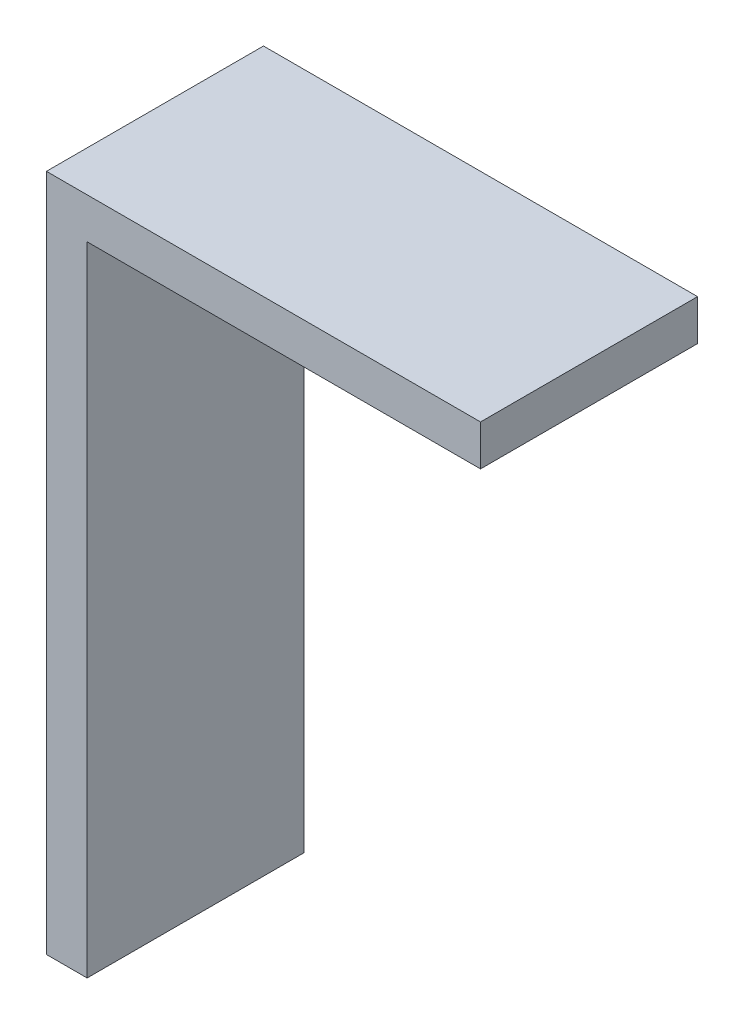
ISO-10303-21;
HEADER;
FILE_DESCRIPTION(('STEP AP214'),'2;1');
FILE_NAME('part.step','',(''),(''),'','','');
FILE_SCHEMA(('AUTOMOTIVE_DESIGN { 1 0 10303 214 1 1 1 1 }'));
ENDSEC;
DATA;
#1=APPLICATION_CONTEXT('core data for automotive mechanical design processes');
#2=APPLICATION_PROTOCOL_DEFINITION('international standard','automotive_design',2000,#1);
#3=PRODUCT_CONTEXT('',#1,'mechanical');
#4=PRODUCT('Part','Part','',(#3));
#5=PRODUCT_RELATED_PRODUCT_CATEGORY('part','',(#4));
#6=PRODUCT_DEFINITION_FORMATION('','',#4);
#7=PRODUCT_DEFINITION_CONTEXT('part definition',#1,'design');
#8=PRODUCT_DEFINITION('design','',#6,#7);
#9=PRODUCT_DEFINITION_SHAPE('','',#8);
#10=(LENGTH_UNIT() NAMED_UNIT(*) SI_UNIT(.MILLI.,.METRE.));
#11=(NAMED_UNIT(*) PLANE_ANGLE_UNIT() SI_UNIT($,.RADIAN.));
#12=(NAMED_UNIT(*) SI_UNIT($,.STERADIAN.) SOLID_ANGLE_UNIT());
#13=UNCERTAINTY_MEASURE_WITH_UNIT(LENGTH_MEASURE(1.E-05),#10,'distance_accuracy_value','');
#14=(GEOMETRIC_REPRESENTATION_CONTEXT(3) GLOBAL_UNCERTAINTY_ASSIGNED_CONTEXT((#13)) GLOBAL_UNIT_ASSIGNED_CONTEXT((#10,
#11,#12)) REPRESENTATION_CONTEXT('',''));
#15=CARTESIAN_POINT('',(0.,0.,0.));
#16=DIRECTION('',(0.,0.,1.));
#17=DIRECTION('',(1.,0.,0.));
#18=AXIS2_PLACEMENT_3D('',#15,#16,#17);
#19=CARTESIAN_POINT('',(0.,0.,160.));
#20=DIRECTION('',(0.,1.,0.));
#21=DIRECTION('',(0.,0.,1.));
#22=AXIS2_PLACEMENT_3D('',#19,#20,#21);
#23=PLANE('',#22);
#24=DIRECTION('',(1.,0.,0.));
#25=VECTOR('',#24,1.);
#26=CARTESIAN_POINT('',(0.,0.,0.));
#27=LINE('',#26,#25);
#28=CARTESIAN_POINT('',(0.,0.,0.));
#29=VERTEX_POINT('',#28);
#30=CARTESIAN_POINT('',(30.,0.,0.));
#31=VERTEX_POINT('',#30);
#32=EDGE_CURVE('E117',#29,#31,#27,.T.);
#33=ORIENTED_EDGE('',*,*,#32,.T.);
#34=DIRECTION('',(0.,0.,-1.));
#35=VECTOR('',#34,1.);
#36=CARTESIAN_POINT('',(30.,0.,160.));
#37=LINE('',#36,#35);
#38=CARTESIAN_POINT('',(30.,0.,160.));
#39=VERTEX_POINT('',#38);
#40=EDGE_CURVE('E11',#39,#31,#37,.T.);
#41=ORIENTED_EDGE('',*,*,#40,.F.);
#42=DIRECTION('',(1.,0.,0.));
#43=VECTOR('',#42,1.);
#44=CARTESIAN_POINT('',(0.,0.,160.));
#45=LINE('',#44,#43);
#46=CARTESIAN_POINT('',(0.,0.,160.));
#47=VERTEX_POINT('',#46);
#48=EDGE_CURVE('E127',#47,#39,#45,.T.);
#49=ORIENTED_EDGE('',*,*,#48,.F.);
#50=DIRECTION('',(0.,0.,-1.));
#51=VECTOR('',#50,1.);
#52=CARTESIAN_POINT('',(0.,0.,160.));
#53=LINE('',#52,#51);
#54=EDGE_CURVE('E113',#47,#29,#53,.T.);
#55=ORIENTED_EDGE('',*,*,#54,.T.);
#56=EDGE_LOOP('',(#33,#41,#49,#55));
#57=FACE_BOUND('',#56,.T.);
#58=ADVANCED_FACE('F33',(#57),#23,.F.);
#59=CARTESIAN_POINT('',(30.,0.,160.));
#60=DIRECTION('',(-1.,0.,0.));
#61=DIRECTION('',(0.,0.,1.));
#62=AXIS2_PLACEMENT_3D('',#59,#60,#61);
#63=PLANE('',#62);
#64=DIRECTION('',(0.,1.,0.));
#65=VECTOR('',#64,1.);
#66=CARTESIAN_POINT('',(30.,0.,0.));
#67=LINE('',#66,#65);
#68=CARTESIAN_POINT('',(30.,470.,0.));
#69=VERTEX_POINT('',#68);
#70=EDGE_CURVE('E120',#31,#69,#67,.T.);
#71=ORIENTED_EDGE('',*,*,#70,.T.);
#72=DIRECTION('',(0.,0.,-1.));
#73=VECTOR('',#72,1.);
#74=CARTESIAN_POINT('',(30.,470.,160.));
#75=LINE('',#74,#73);
#76=CARTESIAN_POINT('',(30.,470.,160.));
#77=VERTEX_POINT('',#76);
#78=EDGE_CURVE('E41',#77,#69,#75,.T.);
#79=ORIENTED_EDGE('',*,*,#78,.F.);
#80=DIRECTION('',(0.,1.,0.));
#81=VECTOR('',#80,1.);
#82=CARTESIAN_POINT('',(30.,0.,160.));
#83=LINE('',#82,#81);
#84=EDGE_CURVE('E86',#39,#77,#83,.T.);
#85=ORIENTED_EDGE('',*,*,#84,.F.);
#86=ORIENTED_EDGE('',*,*,#40,.T.);
#87=EDGE_LOOP('',(#71,#79,#85,#86));
#88=FACE_BOUND('',#87,.T.);
#89=ADVANCED_FACE('F151',(#88),#63,.F.);
#90=CARTESIAN_POINT('',(30.,470.,160.));
#91=DIRECTION('',(0.,1.,0.));
#92=DIRECTION('',(0.,0.,1.));
#93=AXIS2_PLACEMENT_3D('',#90,#91,#92);
#94=PLANE('',#93);
#95=DIRECTION('',(1.,0.,0.));
#96=VECTOR('',#95,1.);
#97=CARTESIAN_POINT('',(30.,470.,0.));
#98=LINE('',#97,#96);
#99=CARTESIAN_POINT('',(320.,470.,0.));
#100=VERTEX_POINT('',#99);
#101=EDGE_CURVE('E122',#69,#100,#98,.T.);
#102=ORIENTED_EDGE('',*,*,#101,.T.);
#103=DIRECTION('',(0.,0.,-1.));
#104=VECTOR('',#103,1.);
#105=CARTESIAN_POINT('',(320.,470.,160.));
#106=LINE('',#105,#104);
#107=CARTESIAN_POINT('',(320.,470.,160.));
#108=VERTEX_POINT('',#107);
#109=EDGE_CURVE('E108',#108,#100,#106,.T.);
#110=ORIENTED_EDGE('',*,*,#109,.F.);
#111=DIRECTION('',(1.,0.,0.));
#112=VECTOR('',#111,1.);
#113=CARTESIAN_POINT('',(30.,470.,160.));
#114=LINE('',#113,#112);
#115=EDGE_CURVE('E99',#77,#108,#114,.T.);
#116=ORIENTED_EDGE('',*,*,#115,.F.);
#117=ORIENTED_EDGE('',*,*,#78,.T.);
#118=EDGE_LOOP('',(#102,#110,#116,#117));
#119=FACE_BOUND('',#118,.T.);
#120=ADVANCED_FACE('F133',(#119),#94,.F.);
#121=CARTESIAN_POINT('',(320.,500.,160.));
#122=DIRECTION('',(-1.,0.,0.));
#123=DIRECTION('',(0.,0.,1.));
#124=AXIS2_PLACEMENT_3D('',#121,#122,#123);
#125=PLANE('',#124);
#126=DIRECTION('',(0.,1.,0.));
#127=VECTOR('',#126,1.);
#128=CARTESIAN_POINT('',(320.,500.,0.));
#129=LINE('',#128,#127);
#130=CARTESIAN_POINT('',(320.,500.,0.));
#131=VERTEX_POINT('',#130);
#132=EDGE_CURVE('E107',#100,#131,#129,.T.);
#133=ORIENTED_EDGE('',*,*,#132,.T.);
#134=DIRECTION('',(0.,0.,-1.));
#135=VECTOR('',#134,1.);
#136=CARTESIAN_POINT('',(320.,500.,160.));
#137=LINE('',#136,#135);
#138=CARTESIAN_POINT('',(320.,500.,160.));
#139=VERTEX_POINT('',#138);
#140=EDGE_CURVE('E104',#139,#131,#137,.T.);
#141=ORIENTED_EDGE('',*,*,#140,.F.);
#142=DIRECTION('',(0.,1.,0.));
#143=VECTOR('',#142,1.);
#144=CARTESIAN_POINT('',(320.,500.,160.));
#145=LINE('',#144,#143);
#146=EDGE_CURVE('E93',#108,#139,#145,.T.);
#147=ORIENTED_EDGE('',*,*,#146,.F.);
#148=ORIENTED_EDGE('',*,*,#109,.T.);
#149=EDGE_LOOP('',(#133,#141,#147,#148));
#150=FACE_BOUND('',#149,.T.);
#151=ADVANCED_FACE('F105',(#150),#125,.F.);
#152=CARTESIAN_POINT('',(0.,500.,160.));
#153=DIRECTION('',(0.,-1.,0.));
#154=DIRECTION('',(0.,0.,-1.));
#155=AXIS2_PLACEMENT_3D('',#152,#153,#154);
#156=PLANE('',#155);
#157=DIRECTION('',(-1.,0.,0.));
#158=VECTOR('',#157,1.);
#159=CARTESIAN_POINT('',(0.,500.,0.));
#160=LINE('',#159,#158);
#161=CARTESIAN_POINT('',(0.,500.,0.));
#162=VERTEX_POINT('',#161);
#163=EDGE_CURVE('E72',#131,#162,#160,.T.);
#164=ORIENTED_EDGE('',*,*,#163,.T.);
#165=DIRECTION('',(0.,0.,-1.));
#166=VECTOR('',#165,1.);
#167=CARTESIAN_POINT('',(0.,500.,160.));
#168=LINE('',#167,#166);
#169=CARTESIAN_POINT('',(0.,500.,160.));
#170=VERTEX_POINT('',#169);
#171=EDGE_CURVE('E109',#170,#162,#168,.T.);
#172=ORIENTED_EDGE('',*,*,#171,.F.);
#173=DIRECTION('',(-1.,0.,0.));
#174=VECTOR('',#173,1.);
#175=CARTESIAN_POINT('',(0.,500.,160.));
#176=LINE('',#175,#174);
#177=EDGE_CURVE('E97',#139,#170,#176,.T.);
#178=ORIENTED_EDGE('',*,*,#177,.F.);
#179=ORIENTED_EDGE('',*,*,#140,.T.);
#180=EDGE_LOOP('',(#164,#172,#178,#179));
#181=FACE_BOUND('',#180,.T.);
#182=ADVANCED_FACE('F111',(#181),#156,.F.);
#183=CARTESIAN_POINT('',(0.,0.,160.));
#184=DIRECTION('',(1.,0.,0.));
#185=DIRECTION('',(0.,0.,-1.));
#186=AXIS2_PLACEMENT_3D('',#183,#184,#185);
#187=PLANE('',#186);
#188=DIRECTION('',(0.,-1.,0.));
#189=VECTOR('',#188,1.);
#190=CARTESIAN_POINT('',(0.,0.,0.));
#191=LINE('',#190,#189);
#192=EDGE_CURVE('E78',#162,#29,#191,.T.);
#193=ORIENTED_EDGE('',*,*,#192,.T.);
#194=ORIENTED_EDGE('',*,*,#54,.F.);
#195=DIRECTION('',(0.,-1.,0.));
#196=VECTOR('',#195,1.);
#197=CARTESIAN_POINT('',(0.,0.,160.));
#198=LINE('',#197,#196);
#199=EDGE_CURVE('E49',#170,#47,#198,.T.);
#200=ORIENTED_EDGE('',*,*,#199,.F.);
#201=ORIENTED_EDGE('',*,*,#171,.T.);
#202=EDGE_LOOP('',(#193,#194,#200,#201));
#203=FACE_BOUND('',#202,.T.);
#204=ADVANCED_FACE('F140',(#203),#187,.F.);
#205=CARTESIAN_POINT('',(0.,0.,160.));
#206=DIRECTION('',(0.,0.,1.));
#207=DIRECTION('',(1.,0.,0.));
#208=AXIS2_PLACEMENT_3D('',#205,#206,#207);
#209=PLANE('',#208);
#210=ORIENTED_EDGE('',*,*,#48,.T.);
#211=ORIENTED_EDGE('',*,*,#84,.T.);
#212=ORIENTED_EDGE('',*,*,#115,.T.);
#213=ORIENTED_EDGE('',*,*,#146,.T.);
#214=ORIENTED_EDGE('',*,*,#177,.T.);
#215=ORIENTED_EDGE('',*,*,#199,.T.);
#216=EDGE_LOOP('',(#210,#211,#212,#213,#214,#215));
#217=FACE_BOUND('',#216,.T.);
#218=ADVANCED_FACE('F95',(#217),#209,.T.);
#219=CARTESIAN_POINT('',(0.,0.,0.));
#220=DIRECTION('',(0.,0.,1.));
#221=DIRECTION('',(1.,0.,0.));
#222=AXIS2_PLACEMENT_3D('',#219,#220,#221);
#223=PLANE('',#222);
#224=ORIENTED_EDGE('',*,*,#32,.F.);
#225=ORIENTED_EDGE('',*,*,#192,.F.);
#226=ORIENTED_EDGE('',*,*,#163,.F.);
#227=ORIENTED_EDGE('',*,*,#132,.F.);
#228=ORIENTED_EDGE('',*,*,#101,.F.);
#229=ORIENTED_EDGE('',*,*,#70,.F.);
#230=EDGE_LOOP('',(#224,#225,#226,#227,#228,#229));
#231=FACE_BOUND('',#230,.T.);
#232=ADVANCED_FACE('F136',(#231),#223,.F.);
#233=CLOSED_SHELL('',(#58,#89,#120,#151,#182,#204,#218,#232));
#234=MANIFOLD_SOLID_BREP('B2',#233);
#235=ADVANCED_BREP_SHAPE_REPRESENTATION('',(#18,#234),#14);
#236=SHAPE_DEFINITION_REPRESENTATION(#9,#235);
ENDSEC;
END-ISO-10303-21;
